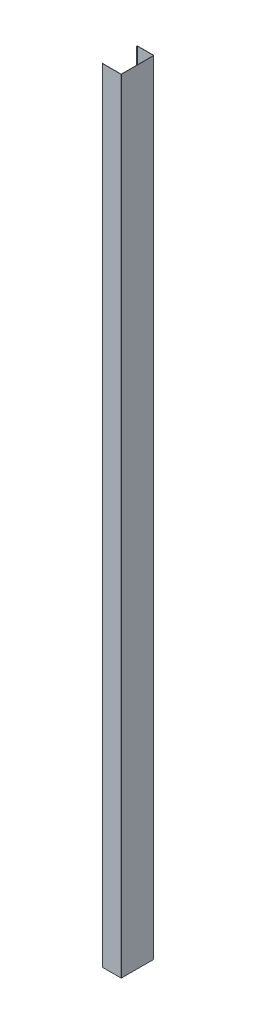
ISO-10303-21;
HEADER;
FILE_DESCRIPTION(('STEP AP214'),'2;1');
FILE_NAME('part.step','',(''),(''),'','','');
FILE_SCHEMA(('AUTOMOTIVE_DESIGN { 1 0 10303 214 1 1 1 1 }'));
ENDSEC;
DATA;
#1=APPLICATION_CONTEXT('core data for automotive mechanical design processes');
#2=APPLICATION_PROTOCOL_DEFINITION('international standard','automotive_design',2000,#1);
#3=PRODUCT_CONTEXT('',#1,'mechanical');
#4=PRODUCT('Part','Part','',(#3));
#5=PRODUCT_RELATED_PRODUCT_CATEGORY('part','',(#4));
#6=PRODUCT_DEFINITION_FORMATION('','',#4);
#7=PRODUCT_DEFINITION_CONTEXT('part definition',#1,'design');
#8=PRODUCT_DEFINITION('design','',#6,#7);
#9=PRODUCT_DEFINITION_SHAPE('','',#8);
#10=(LENGTH_UNIT() NAMED_UNIT(*) SI_UNIT(.MILLI.,.METRE.));
#11=(NAMED_UNIT(*) PLANE_ANGLE_UNIT() SI_UNIT($,.RADIAN.));
#12=(NAMED_UNIT(*) SI_UNIT($,.STERADIAN.) SOLID_ANGLE_UNIT());
#13=UNCERTAINTY_MEASURE_WITH_UNIT(LENGTH_MEASURE(1.E-05),#10,'distance_accuracy_value','');
#14=(GEOMETRIC_REPRESENTATION_CONTEXT(3) GLOBAL_UNCERTAINTY_ASSIGNED_CONTEXT((#13)) GLOBAL_UNIT_ASSIGNED_CONTEXT((#10,
#11,#12)) REPRESENTATION_CONTEXT('',''));
#15=CARTESIAN_POINT('',(0.,0.,0.));
#16=DIRECTION('',(0.,0.,1.));
#17=DIRECTION('',(1.,0.,0.));
#18=AXIS2_PLACEMENT_3D('',#15,#16,#17);
#19=CARTESIAN_POINT('',(-56.3111716302014,0.,98.5));
#20=DIRECTION('',(0.,-1.,0.));
#21=DIRECTION('',(0.,0.,-1.));
#22=AXIS2_PLACEMENT_3D('',#19,#20,#21);
#23=PLANE('',#22);
#24=DIRECTION('',(0.,0.,-1.));
#25=VECTOR('',#24,1.);
#26=CARTESIAN_POINT('',(-56.3111716302014,0.,98.5));
#27=LINE('',#26,#25);
#28=CARTESIAN_POINT('',(-56.3111716302014,0.,98.5));
#29=VERTEX_POINT('',#28);
#30=CARTESIAN_POINT('',(-56.3111716302014,0.,97.75));
#31=VERTEX_POINT('',#30);
#32=EDGE_CURVE('E11',#29,#31,#27,.T.);
#33=ORIENTED_EDGE('',*,*,#32,.F.);
#34=CARTESIAN_POINT('',(-56.3111716302014,0.,97.));
#35=DIRECTION('',(0.,-1.,0.));
#36=DIRECTION('',(0.,0.,-1.));
#37=AXIS2_PLACEMENT_3D('',#34,#35,#36);
#38=CIRCLE('',#37,1.5);
#39=CARTESIAN_POINT('',(-57.8111716302014,0.,97.));
#40=VERTEX_POINT('',#39);
#41=EDGE_CURVE('E249',#40,#29,#38,.F.);
#42=ORIENTED_EDGE('',*,*,#41,.F.);
#43=DIRECTION('',(-1.,0.,0.));
#44=VECTOR('',#43,1.);
#45=CARTESIAN_POINT('',(-57.0611716302014,0.,97.));
#46=LINE('',#45,#44);
#47=CARTESIAN_POINT('',(-57.0611716302014,0.,97.));
#48=VERTEX_POINT('',#47);
#49=EDGE_CURVE('E44',#48,#40,#46,.T.);
#50=ORIENTED_EDGE('',*,*,#49,.F.);
#51=CARTESIAN_POINT('',(-56.3111716302014,0.,97.));
#52=DIRECTION('',(0.,1.,0.));
#53=DIRECTION('',(1.,0.,0.));
#54=AXIS2_PLACEMENT_3D('',#51,#52,#53);
#55=CIRCLE('',#54,0.75);
#56=EDGE_CURVE('E352',#48,#31,#55,.T.);
#57=ORIENTED_EDGE('',*,*,#56,.T.);
#58=EDGE_LOOP('',(#33,#42,#50,#57));
#59=FACE_BOUND('',#58,.T.);
#60=ADVANCED_FACE('F37',(#59),#23,.T.);
#61=CARTESIAN_POINT('',(-57.0611716302014,0.,97.));
#62=DIRECTION('',(0.,-1.,0.));
#63=DIRECTION('',(0.,0.,-1.));
#64=AXIS2_PLACEMENT_3D('',#61,#62,#63);
#65=PLANE('',#64);
#66=DIRECTION('',(1.,0.,0.));
#67=VECTOR('',#66,1.);
#68=CARTESIAN_POINT('',(0.,0.,98.5));
#69=LINE('',#68,#67);
#70=CARTESIAN_POINT('',(-1.49999999999999,0.,98.5));
#71=VERTEX_POINT('',#70);
#72=EDGE_CURVE('E263',#29,#71,#69,.T.);
#73=ORIENTED_EDGE('',*,*,#72,.F.);
#74=ORIENTED_EDGE('',*,*,#32,.T.);
#75=DIRECTION('',(1.,0.,0.));
#76=VECTOR('',#75,1.);
#77=CARTESIAN_POINT('',(0.,0.,97.75));
#78=LINE('',#77,#76);
#79=CARTESIAN_POINT('',(-1.49999999999999,0.,97.75));
#80=VERTEX_POINT('',#79);
#81=EDGE_CURVE('E349',#31,#80,#78,.T.);
#82=ORIENTED_EDGE('',*,*,#81,.T.);
#83=DIRECTION('',(0.,0.,1.));
#84=VECTOR('',#83,1.);
#85=CARTESIAN_POINT('',(-1.49999999999999,0.,97.75));
#86=LINE('',#85,#84);
#87=EDGE_CURVE('E224',#80,#71,#86,.T.);
#88=ORIENTED_EDGE('',*,*,#87,.T.);
#89=EDGE_LOOP('',(#73,#74,#82,#88));
#90=FACE_BOUND('',#89,.T.);
#91=ADVANCED_FACE('F377',(#90),#65,.T.);
#92=CARTESIAN_POINT('',(0.,0.,97.));
#93=DIRECTION('',(0.,-1.,0.));
#94=DIRECTION('',(0.,0.,-1.));
#95=AXIS2_PLACEMENT_3D('',#92,#93,#94);
#96=PLANE('',#95);
#97=DIRECTION('',(-1.,0.,0.));
#98=VECTOR('',#97,1.);
#99=CARTESIAN_POINT('',(0.,0.,97.));
#100=LINE('',#99,#98);
#101=CARTESIAN_POINT('',(0.,0.,97.));
#102=VERTEX_POINT('',#101);
#103=CARTESIAN_POINT('',(-0.749999999999988,0.,97.));
#104=VERTEX_POINT('',#103);
#105=EDGE_CURVE('E226',#102,#104,#100,.T.);
#106=ORIENTED_EDGE('',*,*,#105,.F.);
#107=CARTESIAN_POINT('',(-1.49999999999999,0.,97.));
#108=DIRECTION('',(0.,-1.,0.));
#109=DIRECTION('',(0.,0.,-1.));
#110=AXIS2_PLACEMENT_3D('',#107,#108,#109);
#111=CIRCLE('',#110,1.5);
#112=EDGE_CURVE('E266',#71,#102,#111,.F.);
#113=ORIENTED_EDGE('',*,*,#112,.F.);
#114=ORIENTED_EDGE('',*,*,#87,.F.);
#115=CARTESIAN_POINT('',(-1.49999999999999,0.,97.));
#116=DIRECTION('',(0.,1.,0.));
#117=DIRECTION('',(1.,0.,0.));
#118=AXIS2_PLACEMENT_3D('',#115,#116,#117);
#119=CIRCLE('',#118,0.75);
#120=EDGE_CURVE('E343',#80,#104,#119,.T.);
#121=ORIENTED_EDGE('',*,*,#120,.T.);
#122=EDGE_LOOP('',(#106,#113,#114,#121));
#123=FACE_BOUND('',#122,.T.);
#124=ADVANCED_FACE('F384',(#123),#96,.T.);
#125=CARTESIAN_POINT('',(-1.49999999999999,0.,97.75));
#126=DIRECTION('',(0.,-1.,0.));
#127=DIRECTION('',(0.,0.,-1.));
#128=AXIS2_PLACEMENT_3D('',#125,#126,#127);
#129=PLANE('',#128);
#130=DIRECTION('',(0.,0.,-1.));
#131=VECTOR('',#130,1.);
#132=CARTESIAN_POINT('',(0.,0.,0.));
#133=LINE('',#132,#131);
#134=CARTESIAN_POINT('',(0.,0.,1.5));
#135=VERTEX_POINT('',#134);
#136=EDGE_CURVE('E272',#102,#135,#133,.T.);
#137=ORIENTED_EDGE('',*,*,#136,.F.);
#138=ORIENTED_EDGE('',*,*,#105,.T.);
#139=DIRECTION('',(0.,0.,-1.));
#140=VECTOR('',#139,1.);
#141=CARTESIAN_POINT('',(-0.75,0.,0.));
#142=LINE('',#141,#140);
#143=CARTESIAN_POINT('',(-0.75,0.,1.5));
#144=VERTEX_POINT('',#143);
#145=EDGE_CURVE('E341',#104,#144,#142,.T.);
#146=ORIENTED_EDGE('',*,*,#145,.T.);
#147=DIRECTION('',(1.,0.,0.));
#148=VECTOR('',#147,1.);
#149=CARTESIAN_POINT('',(-0.75,0.,1.5));
#150=LINE('',#149,#148);
#151=EDGE_CURVE('E220',#144,#135,#150,.T.);
#152=ORIENTED_EDGE('',*,*,#151,.T.);
#153=EDGE_LOOP('',(#137,#138,#146,#152));
#154=FACE_BOUND('',#153,.T.);
#155=ADVANCED_FACE('F391',(#154),#129,.T.);
#156=CARTESIAN_POINT('',(-1.5,0.,0.));
#157=DIRECTION('',(0.,-1.,0.));
#158=DIRECTION('',(0.,0.,-1.));
#159=AXIS2_PLACEMENT_3D('',#156,#157,#158);
#160=PLANE('',#159);
#161=DIRECTION('',(0.,0.,1.));
#162=VECTOR('',#161,1.);
#163=CARTESIAN_POINT('',(-1.5,0.,0.));
#164=LINE('',#163,#162);
#165=CARTESIAN_POINT('',(-1.5,0.,0.));
#166=VERTEX_POINT('',#165);
#167=CARTESIAN_POINT('',(-1.5,0.,0.75));
#168=VERTEX_POINT('',#167);
#169=EDGE_CURVE('E222',#166,#168,#164,.T.);
#170=ORIENTED_EDGE('',*,*,#169,.F.);
#171=CARTESIAN_POINT('',(-1.5,0.,1.5));
#172=DIRECTION('',(0.,-1.,0.));
#173=DIRECTION('',(0.,0.,-1.));
#174=AXIS2_PLACEMENT_3D('',#171,#172,#173);
#175=CIRCLE('',#174,1.5);
#176=EDGE_CURVE('E275',#135,#166,#175,.F.);
#177=ORIENTED_EDGE('',*,*,#176,.F.);
#178=ORIENTED_EDGE('',*,*,#151,.F.);
#179=CARTESIAN_POINT('',(-1.5,0.,1.5));
#180=DIRECTION('',(0.,1.,0.));
#181=DIRECTION('',(1.,0.,0.));
#182=AXIS2_PLACEMENT_3D('',#179,#180,#181);
#183=CIRCLE('',#182,0.75);
#184=EDGE_CURVE('E327',#144,#168,#183,.T.);
#185=ORIENTED_EDGE('',*,*,#184,.T.);
#186=EDGE_LOOP('',(#170,#177,#178,#185));
#187=FACE_BOUND('',#186,.T.);
#188=ADVANCED_FACE('F339',(#187),#160,.T.);
#189=CARTESIAN_POINT('',(-0.75,0.,1.5));
#190=DIRECTION('',(0.,-1.,0.));
#191=DIRECTION('',(0.,0.,-1.));
#192=AXIS2_PLACEMENT_3D('',#189,#190,#191);
#193=PLANE('',#192);
#194=DIRECTION('',(-1.,0.,0.));
#195=VECTOR('',#194,1.);
#196=CARTESIAN_POINT('',(-50.,0.,0.));
#197=LINE('',#196,#195);
#198=CARTESIAN_POINT('',(-48.5,0.,0.));
#199=VERTEX_POINT('',#198);
#200=EDGE_CURVE('E278',#166,#199,#197,.T.);
#201=ORIENTED_EDGE('',*,*,#200,.F.);
#202=ORIENTED_EDGE('',*,*,#169,.T.);
#203=DIRECTION('',(1.,0.,0.));
#204=VECTOR('',#203,1.);
#205=CARTESIAN_POINT('',(-50.,0.,0.75));
#206=LINE('',#205,#204);
#207=CARTESIAN_POINT('',(-48.5,0.,0.75));
#208=VERTEX_POINT('',#207);
#209=EDGE_CURVE('E333',#168,#208,#206,.F.);
#210=ORIENTED_EDGE('',*,*,#209,.T.);
#211=DIRECTION('',(0.,0.,-1.));
#212=VECTOR('',#211,1.);
#213=CARTESIAN_POINT('',(-48.5,0.,0.75));
#214=LINE('',#213,#212);
#215=EDGE_CURVE('E217',#208,#199,#214,.T.);
#216=ORIENTED_EDGE('',*,*,#215,.T.);
#217=EDGE_LOOP('',(#201,#202,#210,#216));
#218=FACE_BOUND('',#217,.T.);
#219=ADVANCED_FACE('F401',(#218),#193,.T.);
#220=CARTESIAN_POINT('',(-50.,0.,1.5));
#221=DIRECTION('',(0.,-1.,0.));
#222=DIRECTION('',(0.,0.,-1.));
#223=AXIS2_PLACEMENT_3D('',#220,#221,#222);
#224=PLANE('',#223);
#225=DIRECTION('',(1.,0.,0.));
#226=VECTOR('',#225,1.);
#227=CARTESIAN_POINT('',(-50.,0.,1.5));
#228=LINE('',#227,#226);
#229=CARTESIAN_POINT('',(-50.,0.,1.5));
#230=VERTEX_POINT('',#229);
#231=CARTESIAN_POINT('',(-49.25,0.,1.5));
#232=VERTEX_POINT('',#231);
#233=EDGE_CURVE('E59',#230,#232,#228,.T.);
#234=ORIENTED_EDGE('',*,*,#233,.F.);
#235=CARTESIAN_POINT('',(-48.5,0.,1.5));
#236=DIRECTION('',(0.,-1.,0.));
#237=DIRECTION('',(0.,0.,-1.));
#238=AXIS2_PLACEMENT_3D('',#235,#236,#237);
#239=CIRCLE('',#238,1.5);
#240=EDGE_CURVE('E281',#199,#230,#239,.F.);
#241=ORIENTED_EDGE('',*,*,#240,.F.);
#242=ORIENTED_EDGE('',*,*,#215,.F.);
#243=CARTESIAN_POINT('',(-48.5,0.,1.5));
#244=DIRECTION('',(0.,1.,0.));
#245=DIRECTION('',(1.,0.,0.));
#246=AXIS2_PLACEMENT_3D('',#243,#244,#245);
#247=CIRCLE('',#246,0.75);
#248=EDGE_CURVE('E336',#208,#232,#247,.T.);
#249=ORIENTED_EDGE('',*,*,#248,.T.);
#250=EDGE_LOOP('',(#234,#241,#242,#249));
#251=FACE_BOUND('',#250,.T.);
#252=ADVANCED_FACE('F405',(#251),#224,.T.);
#253=CARTESIAN_POINT('',(-48.5,0.,0.75));
#254=DIRECTION('',(0.,-1.,0.));
#255=DIRECTION('',(0.,0.,-1.));
#256=AXIS2_PLACEMENT_3D('',#253,#254,#255);
#257=PLANE('',#256);
#258=DIRECTION('',(0.,0.,1.));
#259=VECTOR('',#258,1.);
#260=CARTESIAN_POINT('',(-50.,0.,0.));
#261=LINE('',#260,#259);
#262=CARTESIAN_POINT('',(-50.,0.,3.));
#263=VERTEX_POINT('',#262);
#264=EDGE_CURVE('E192',#230,#263,#261,.T.);
#265=ORIENTED_EDGE('',*,*,#264,.F.);
#266=ORIENTED_EDGE('',*,*,#233,.T.);
#267=DIRECTION('',(0.,0.,-1.));
#268=VECTOR('',#267,1.);
#269=CARTESIAN_POINT('',(-49.25,0.,0.));
#270=LINE('',#269,#268);
#271=CARTESIAN_POINT('',(-49.25,0.,3.));
#272=VERTEX_POINT('',#271);
#273=EDGE_CURVE('E207',#232,#272,#270,.F.);
#274=ORIENTED_EDGE('',*,*,#273,.T.);
#275=DIRECTION('',(-1.,0.,0.));
#276=VECTOR('',#275,1.);
#277=CARTESIAN_POINT('',(-49.25,0.,3.));
#278=LINE('',#277,#276);
#279=EDGE_CURVE('E415',#272,#263,#278,.T.);
#280=ORIENTED_EDGE('',*,*,#279,.T.);
#281=EDGE_LOOP('',(#265,#266,#274,#280));
#282=FACE_BOUND('',#281,.T.);
#283=ADVANCED_FACE('F413',(#282),#257,.T.);
#284=CARTESIAN_POINT('',(-50.,2463.46200271975,0.));
#285=DIRECTION('',(1.,0.,0.));
#286=DIRECTION('',(0.,0.,-1.));
#287=AXIS2_PLACEMENT_3D('',#284,#285,#286);
#288=PLANE('',#287);
#289=DIRECTION('',(0.,0.,-1.));
#290=VECTOR('',#289,1.);
#291=CARTESIAN_POINT('',(-50.,2349.25,0.));
#292=LINE('',#291,#290);
#293=CARTESIAN_POINT('',(-50.,2349.25,3.));
#294=VERTEX_POINT('',#293);
#295=CARTESIAN_POINT('',(-50.,2349.25,1.5));
#296=VERTEX_POINT('',#295);
#297=EDGE_CURVE('E183',#294,#296,#292,.T.);
#298=ORIENTED_EDGE('',*,*,#297,.T.);
#299=DIRECTION('',(0.,-1.,0.));
#300=VECTOR('',#299,1.);
#301=CARTESIAN_POINT('',(-50.,2463.46200271975,1.5));
#302=LINE('',#301,#300);
#303=EDGE_CURVE('E284',#296,#230,#302,.T.);
#304=ORIENTED_EDGE('',*,*,#303,.T.);
#305=ORIENTED_EDGE('',*,*,#264,.T.);
#306=DIRECTION('',(0.,-1.,0.));
#307=VECTOR('',#306,1.);
#308=CARTESIAN_POINT('',(-50.,2463.46200271975,3.));
#309=LINE('',#308,#307);
#310=EDGE_CURVE('E210',#294,#263,#309,.T.);
#311=ORIENTED_EDGE('',*,*,#310,.F.);
#312=EDGE_LOOP('',(#298,#304,#305,#311));
#313=FACE_BOUND('',#312,.T.);
#314=ADVANCED_FACE('F515',(#313),#288,.F.);
#315=CARTESIAN_POINT('',(-49.25,2463.46200271975,3.));
#316=DIRECTION('',(0.,0.,1.));
#317=DIRECTION('',(1.,0.,0.));
#318=AXIS2_PLACEMENT_3D('',#315,#316,#317);
#319=PLANE('',#318);
#320=DIRECTION('',(0.,-1.,0.));
#321=VECTOR('',#320,1.);
#322=CARTESIAN_POINT('',(-49.25,2463.46200271975,3.));
#323=LINE('',#322,#321);
#324=CARTESIAN_POINT('',(-49.25,2349.25,3.));
#325=VERTEX_POINT('',#324);
#326=EDGE_CURVE('E208',#325,#272,#323,.T.);
#327=ORIENTED_EDGE('',*,*,#326,.F.);
#328=DIRECTION('',(-1.,0.,0.));
#329=VECTOR('',#328,1.);
#330=CARTESIAN_POINT('',(-50.,2349.25,3.));
#331=LINE('',#330,#329);
#332=EDGE_CURVE('E179',#294,#325,#331,.F.);
#333=ORIENTED_EDGE('',*,*,#332,.F.);
#334=ORIENTED_EDGE('',*,*,#310,.T.);
#335=ORIENTED_EDGE('',*,*,#279,.F.);
#336=EDGE_LOOP('',(#327,#333,#334,#335));
#337=FACE_BOUND('',#336,.T.);
#338=ADVANCED_FACE('F518',(#337),#319,.T.);
#339=CARTESIAN_POINT('',(-49.25,2463.46200271975,0.));
#340=DIRECTION('',(1.,0.,0.));
#341=DIRECTION('',(0.,0.,-1.));
#342=AXIS2_PLACEMENT_3D('',#339,#340,#341);
#343=PLANE('',#342);
#344=DIRECTION('',(0.,-1.,0.));
#345=VECTOR('',#344,1.);
#346=CARTESIAN_POINT('',(-49.25,2463.46200271975,1.5));
#347=LINE('',#346,#345);
#348=CARTESIAN_POINT('',(-49.25,2349.25,1.5));
#349=VERTEX_POINT('',#348);
#350=EDGE_CURVE('E199',#349,#232,#347,.T.);
#351=ORIENTED_EDGE('',*,*,#350,.F.);
#352=DIRECTION('',(0.,0.,-1.));
#353=VECTOR('',#352,1.);
#354=CARTESIAN_POINT('',(-49.25,2349.25,0.));
#355=LINE('',#354,#353);
#356=EDGE_CURVE('E173',#325,#349,#355,.T.);
#357=ORIENTED_EDGE('',*,*,#356,.F.);
#358=ORIENTED_EDGE('',*,*,#326,.T.);
#359=ORIENTED_EDGE('',*,*,#273,.F.);
#360=EDGE_LOOP('',(#351,#357,#358,#359));
#361=FACE_BOUND('',#360,.T.);
#362=ADVANCED_FACE('F205',(#361),#343,.T.);
#363=CARTESIAN_POINT('',(-48.5,2463.46200271975,1.5));
#364=DIRECTION('',(0.,-1.,0.));
#365=DIRECTION('',(0.,0.,-1.));
#366=AXIS2_PLACEMENT_3D('',#363,#364,#365);
#367=CYLINDRICAL_SURFACE('',#366,0.75);
#368=DIRECTION('',(0.,-1.,0.));
#369=VECTOR('',#368,1.);
#370=CARTESIAN_POINT('',(-48.5,2463.46200271975,0.75));
#371=LINE('',#370,#369);
#372=CARTESIAN_POINT('',(-48.5,2349.25,0.75));
#373=VERTEX_POINT('',#372);
#374=EDGE_CURVE('E202',#373,#208,#371,.T.);
#375=ORIENTED_EDGE('',*,*,#374,.F.);
#376=CARTESIAN_POINT('',(-48.5,2349.25,1.5));
#377=DIRECTION('',(0.,1.,0.));
#378=DIRECTION('',(-1.,0.,0.));
#379=AXIS2_PLACEMENT_3D('',#376,#377,#378);
#380=CIRCLE('',#379,0.75);
#381=EDGE_CURVE('E188',#349,#373,#380,.F.);
#382=ORIENTED_EDGE('',*,*,#381,.F.);
#383=ORIENTED_EDGE('',*,*,#350,.T.);
#384=ORIENTED_EDGE('',*,*,#248,.F.);
#385=EDGE_LOOP('',(#375,#382,#383,#384));
#386=FACE_BOUND('',#385,.T.);
#387=ADVANCED_FACE('F197',(#386),#367,.F.);
#388=CARTESIAN_POINT('',(-50.,2463.46200271975,0.75));
#389=DIRECTION('',(0.,0.,1.));
#390=DIRECTION('',(1.,0.,0.));
#391=AXIS2_PLACEMENT_3D('',#388,#389,#390);
#392=PLANE('',#391);
#393=DIRECTION('',(0.,-1.,0.));
#394=VECTOR('',#393,1.);
#395=CARTESIAN_POINT('',(-1.5,2463.46200271975,0.75));
#396=LINE('',#395,#394);
#397=CARTESIAN_POINT('',(-1.5,2349.25,0.75));
#398=VERTEX_POINT('',#397);
#399=EDGE_CURVE('E212',#398,#168,#396,.T.);
#400=ORIENTED_EDGE('',*,*,#399,.F.);
#401=DIRECTION('',(1.,0.,0.));
#402=VECTOR('',#401,1.);
#403=CARTESIAN_POINT('',(-50.,2349.25,0.75));
#404=LINE('',#403,#402);
#405=EDGE_CURVE('E438',#373,#398,#404,.T.);
#406=ORIENTED_EDGE('',*,*,#405,.F.);
#407=ORIENTED_EDGE('',*,*,#374,.T.);
#408=ORIENTED_EDGE('',*,*,#209,.F.);
#409=EDGE_LOOP('',(#400,#406,#407,#408));
#410=FACE_BOUND('',#409,.T.);
#411=ADVANCED_FACE('F334',(#410),#392,.T.);
#412=CARTESIAN_POINT('',(-1.5,2463.46200271975,1.5));
#413=DIRECTION('',(0.,-1.,0.));
#414=DIRECTION('',(0.,0.,-1.));
#415=AXIS2_PLACEMENT_3D('',#412,#413,#414);
#416=CYLINDRICAL_SURFACE('',#415,0.75);
#417=DIRECTION('',(0.,-1.,0.));
#418=VECTOR('',#417,1.);
#419=CARTESIAN_POINT('',(-0.75,2463.46200271975,1.5));
#420=LINE('',#419,#418);
#421=CARTESIAN_POINT('',(-0.75,2349.25,1.5));
#422=VERTEX_POINT('',#421);
#423=EDGE_CURVE('E316',#422,#144,#420,.T.);
#424=ORIENTED_EDGE('',*,*,#423,.F.);
#425=CARTESIAN_POINT('',(-1.5,2349.25,1.5));
#426=DIRECTION('',(0.,1.,0.));
#427=DIRECTION('',(-1.,0.,0.));
#428=AXIS2_PLACEMENT_3D('',#425,#426,#427);
#429=CIRCLE('',#428,0.75);
#430=EDGE_CURVE('E329',#398,#422,#429,.F.);
#431=ORIENTED_EDGE('',*,*,#430,.F.);
#432=ORIENTED_EDGE('',*,*,#399,.T.);
#433=ORIENTED_EDGE('',*,*,#184,.F.);
#434=EDGE_LOOP('',(#424,#431,#432,#433));
#435=FACE_BOUND('',#434,.T.);
#436=ADVANCED_FACE('F325',(#435),#416,.F.);
#437=CARTESIAN_POINT('',(-0.75,2463.46200271975,0.));
#438=DIRECTION('',(-1.,0.,0.));
#439=DIRECTION('',(0.,0.,1.));
#440=AXIS2_PLACEMENT_3D('',#437,#438,#439);
#441=PLANE('',#440);
#442=DIRECTION('',(0.,-1.,0.));
#443=VECTOR('',#442,1.);
#444=CARTESIAN_POINT('',(-0.749999999999988,2463.46200271975,97.));
#445=LINE('',#444,#443);
#446=CARTESIAN_POINT('',(-0.749999999999988,2349.25,97.));
#447=VERTEX_POINT('',#446);
#448=EDGE_CURVE('E313',#447,#104,#445,.T.);
#449=ORIENTED_EDGE('',*,*,#448,.F.);
#450=DIRECTION('',(0.,0.,1.));
#451=VECTOR('',#450,1.);
#452=CARTESIAN_POINT('',(-0.75,2349.25,0.));
#453=LINE('',#452,#451);
#454=EDGE_CURVE('E429',#422,#447,#453,.T.);
#455=ORIENTED_EDGE('',*,*,#454,.F.);
#456=ORIENTED_EDGE('',*,*,#423,.T.);
#457=ORIENTED_EDGE('',*,*,#145,.F.);
#458=EDGE_LOOP('',(#449,#455,#456,#457));
#459=FACE_BOUND('',#458,.T.);
#460=ADVANCED_FACE('F530',(#459),#441,.T.);
#461=CARTESIAN_POINT('',(-1.49999999999999,2463.46200271975,97.));
#462=DIRECTION('',(0.,-1.,0.));
#463=DIRECTION('',(0.,0.,-1.));
#464=AXIS2_PLACEMENT_3D('',#461,#462,#463);
#465=CYLINDRICAL_SURFACE('',#464,0.75);
#466=DIRECTION('',(0.,-1.,0.));
#467=VECTOR('',#466,1.);
#468=CARTESIAN_POINT('',(-1.49999999999999,2463.46200271975,97.75));
#469=LINE('',#468,#467);
#470=CARTESIAN_POINT('',(-1.49999999999999,2349.25,97.75));
#471=VERTEX_POINT('',#470);
#472=EDGE_CURVE('E310',#471,#80,#469,.T.);
#473=ORIENTED_EDGE('',*,*,#472,.F.);
#474=CARTESIAN_POINT('',(-1.49999999999999,2349.25,97.));
#475=DIRECTION('',(0.,1.,0.));
#476=DIRECTION('',(-1.,0.,0.));
#477=AXIS2_PLACEMENT_3D('',#474,#475,#476);
#478=CIRCLE('',#477,0.75);
#479=EDGE_CURVE('E461',#447,#471,#478,.F.);
#480=ORIENTED_EDGE('',*,*,#479,.F.);
#481=ORIENTED_EDGE('',*,*,#448,.T.);
#482=ORIENTED_EDGE('',*,*,#120,.F.);
#483=EDGE_LOOP('',(#473,#480,#481,#482));
#484=FACE_BOUND('',#483,.T.);
#485=ADVANCED_FACE('F533',(#484),#465,.F.);
#486=CARTESIAN_POINT('',(0.,2463.46200271975,97.75));
#487=DIRECTION('',(0.,0.,-1.));
#488=DIRECTION('',(-1.,0.,0.));
#489=AXIS2_PLACEMENT_3D('',#486,#487,#488);
#490=PLANE('',#489);
#491=DIRECTION('',(0.,-1.,0.));
#492=VECTOR('',#491,1.);
#493=CARTESIAN_POINT('',(-56.3111716302014,2463.46200271975,97.75));
#494=LINE('',#493,#492);
#495=CARTESIAN_POINT('',(-56.3111716302014,2349.25,97.75));
#496=VERTEX_POINT('',#495);
#497=EDGE_CURVE('E307',#496,#31,#494,.T.);
#498=ORIENTED_EDGE('',*,*,#497,.F.);
#499=DIRECTION('',(-1.,0.,0.));
#500=VECTOR('',#499,1.);
#501=CARTESIAN_POINT('',(0.,2349.25,97.75));
#502=LINE('',#501,#500);
#503=EDGE_CURVE('E453',#471,#496,#502,.T.);
#504=ORIENTED_EDGE('',*,*,#503,.F.);
#505=ORIENTED_EDGE('',*,*,#472,.T.);
#506=ORIENTED_EDGE('',*,*,#81,.F.);
#507=EDGE_LOOP('',(#498,#504,#505,#506));
#508=FACE_BOUND('',#507,.T.);
#509=ADVANCED_FACE('F373',(#508),#490,.T.);
#510=CARTESIAN_POINT('',(-56.3111716302014,2463.46200271975,97.));
#511=DIRECTION('',(0.,-1.,0.));
#512=DIRECTION('',(0.,0.,-1.));
#513=AXIS2_PLACEMENT_3D('',#510,#511,#512);
#514=CYLINDRICAL_SURFACE('',#513,0.75);
#515=DIRECTION('',(0.,-1.,0.));
#516=VECTOR('',#515,1.);
#517=CARTESIAN_POINT('',(-57.0611716302014,2463.46200271975,97.));
#518=LINE('',#517,#516);
#519=CARTESIAN_POINT('',(-57.0611716302014,2349.25,97.));
#520=VERTEX_POINT('',#519);
#521=EDGE_CURVE('E305',#520,#48,#518,.T.);
#522=ORIENTED_EDGE('',*,*,#521,.F.);
#523=CARTESIAN_POINT('',(-56.3111716302014,2349.25,97.));
#524=DIRECTION('',(0.,1.,0.));
#525=DIRECTION('',(-1.,0.,0.));
#526=AXIS2_PLACEMENT_3D('',#523,#524,#525);
#527=CIRCLE('',#526,0.75);
#528=EDGE_CURVE('E370',#496,#520,#527,.F.);
#529=ORIENTED_EDGE('',*,*,#528,.F.);
#530=ORIENTED_EDGE('',*,*,#497,.T.);
#531=ORIENTED_EDGE('',*,*,#56,.F.);
#532=EDGE_LOOP('',(#522,#529,#530,#531));
#533=FACE_BOUND('',#532,.T.);
#534=ADVANCED_FACE('F367',(#533),#514,.F.);
#535=CARTESIAN_POINT('',(-57.0611716302014,2463.46200271975,98.5));
#536=DIRECTION('',(1.,0.,0.));
#537=DIRECTION('',(0.,0.,-1.));
#538=AXIS2_PLACEMENT_3D('',#535,#536,#537);
#539=PLANE('',#538);
#540=DIRECTION('',(0.,-1.,0.));
#541=VECTOR('',#540,1.);
#542=CARTESIAN_POINT('',(-57.0611716302014,2463.46200271975,95.5));
#543=LINE('',#542,#541);
#544=CARTESIAN_POINT('',(-57.0611716302014,2349.25,95.5));
#545=VERTEX_POINT('',#544);
#546=CARTESIAN_POINT('',(-57.0611716302014,0.,95.5));
#547=VERTEX_POINT('',#546);
#548=EDGE_CURVE('E303',#545,#547,#543,.T.);
#549=ORIENTED_EDGE('',*,*,#548,.F.);
#550=DIRECTION('',(0.,0.,-1.));
#551=VECTOR('',#550,1.);
#552=CARTESIAN_POINT('',(-57.0611716302014,2349.25,98.5));
#553=LINE('',#552,#551);
#554=EDGE_CURVE('E364',#520,#545,#553,.T.);
#555=ORIENTED_EDGE('',*,*,#554,.F.);
#556=ORIENTED_EDGE('',*,*,#521,.T.);
#557=DIRECTION('',(0.,0.,-1.));
#558=VECTOR('',#557,1.);
#559=CARTESIAN_POINT('',(-57.0611716302014,0.,98.5));
#560=LINE('',#559,#558);
#561=EDGE_CURVE('E237',#547,#48,#560,.F.);
#562=ORIENTED_EDGE('',*,*,#561,.F.);
#563=EDGE_LOOP('',(#549,#555,#556,#562));
#564=FACE_BOUND('',#563,.T.);
#565=ADVANCED_FACE('F361',(#564),#539,.T.);
#566=CARTESIAN_POINT('',(-57.8111716302014,2463.46200271975,95.5));
#567=DIRECTION('',(0.,0.,-1.));
#568=DIRECTION('',(-1.,0.,0.));
#569=AXIS2_PLACEMENT_3D('',#566,#567,#568);
#570=PLANE('',#569);
#571=DIRECTION('',(0.,-1.,0.));
#572=VECTOR('',#571,1.);
#573=CARTESIAN_POINT('',(-57.8111716302014,2463.46200271975,95.5));
#574=LINE('',#573,#572);
#575=CARTESIAN_POINT('',(-57.8111716302014,2349.25,95.5));
#576=VERTEX_POINT('',#575);
#577=CARTESIAN_POINT('',(-57.8111716302014,0.,95.5));
#578=VERTEX_POINT('',#577);
#579=EDGE_CURVE('E255',#576,#578,#574,.T.);
#580=ORIENTED_EDGE('',*,*,#579,.F.);
#581=DIRECTION('',(-1.,0.,0.));
#582=VECTOR('',#581,1.);
#583=CARTESIAN_POINT('',(-57.8111716302014,2349.25,95.5));
#584=LINE('',#583,#582);
#585=EDGE_CURVE('E358',#576,#545,#584,.F.);
#586=ORIENTED_EDGE('',*,*,#585,.T.);
#587=ORIENTED_EDGE('',*,*,#548,.T.);
#588=DIRECTION('',(1.,0.,0.));
#589=VECTOR('',#588,1.);
#590=CARTESIAN_POINT('',(-57.8111716302014,0.,95.5));
#591=LINE('',#590,#589);
#592=EDGE_CURVE('E260',#578,#547,#591,.T.);
#593=ORIENTED_EDGE('',*,*,#592,.F.);
#594=EDGE_LOOP('',(#580,#586,#587,#593));
#595=FACE_BOUND('',#594,.T.);
#596=ADVANCED_FACE('F355',(#595),#570,.T.);
#597=CARTESIAN_POINT('',(-57.8111716302014,2463.46200271975,98.5));
#598=DIRECTION('',(1.,0.,0.));
#599=DIRECTION('',(0.,0.,-1.));
#600=AXIS2_PLACEMENT_3D('',#597,#598,#599);
#601=PLANE('',#600);
#602=DIRECTION('',(0.,0.,-1.));
#603=VECTOR('',#602,1.);
#604=CARTESIAN_POINT('',(-57.8111716302014,2349.25,98.5));
#605=LINE('',#604,#603);
#606=CARTESIAN_POINT('',(-57.8111716302014,2349.25,97.));
#607=VERTEX_POINT('',#606);
#608=EDGE_CURVE('E203',#607,#576,#605,.T.);
#609=ORIENTED_EDGE('',*,*,#608,.T.);
#610=ORIENTED_EDGE('',*,*,#579,.T.);
#611=DIRECTION('',(0.,0.,1.));
#612=VECTOR('',#611,1.);
#613=CARTESIAN_POINT('',(-57.8111716302014,0.,98.5));
#614=LINE('',#613,#612);
#615=EDGE_CURVE('E234',#578,#40,#614,.T.);
#616=ORIENTED_EDGE('',*,*,#615,.T.);
#617=DIRECTION('',(0.,-1.,0.));
#618=VECTOR('',#617,1.);
#619=CARTESIAN_POINT('',(-57.8111716302014,2463.46200271975,97.));
#620=LINE('',#619,#618);
#621=EDGE_CURVE('E246',#607,#40,#620,.T.);
#622=ORIENTED_EDGE('',*,*,#621,.F.);
#623=EDGE_LOOP('',(#609,#610,#616,#622));
#624=FACE_BOUND('',#623,.T.);
#625=ADVANCED_FACE('F258',(#624),#601,.F.);
#626=CARTESIAN_POINT('',(-56.3111716302014,2463.46200271975,97.));
#627=DIRECTION('',(0.,-1.,0.));
#628=DIRECTION('',(0.,0.,-1.));
#629=AXIS2_PLACEMENT_3D('',#626,#627,#628);
#630=CYLINDRICAL_SURFACE('',#629,1.5);
#631=CARTESIAN_POINT('',(-56.3111716302014,2349.25,97.));
#632=DIRECTION('',(0.,-1.,0.));
#633=DIRECTION('',(1.,0.,0.));
#634=AXIS2_PLACEMENT_3D('',#631,#632,#633);
#635=CIRCLE('',#634,1.5);
#636=CARTESIAN_POINT('',(-56.3111716302014,2349.25,98.5));
#637=VERTEX_POINT('',#636);
#638=EDGE_CURVE('E252',#637,#607,#635,.T.);
#639=ORIENTED_EDGE('',*,*,#638,.T.);
#640=ORIENTED_EDGE('',*,*,#621,.T.);
#641=ORIENTED_EDGE('',*,*,#41,.T.);
#642=DIRECTION('',(0.,-1.,0.));
#643=VECTOR('',#642,1.);
#644=CARTESIAN_POINT('',(-56.3111716302014,2463.46200271975,98.5));
#645=LINE('',#644,#643);
#646=EDGE_CURVE('E256',#637,#29,#645,.T.);
#647=ORIENTED_EDGE('',*,*,#646,.F.);
#648=EDGE_LOOP('',(#639,#640,#641,#647));
#649=FACE_BOUND('',#648,.T.);
#650=ADVANCED_FACE('F247',(#649),#630,.T.);
#651=CARTESIAN_POINT('',(0.,2463.46200271975,98.5));
#652=DIRECTION('',(0.,0.,-1.));
#653=DIRECTION('',(-1.,0.,0.));
#654=AXIS2_PLACEMENT_3D('',#651,#652,#653);
#655=PLANE('',#654);
#656=DIRECTION('',(-1.,0.,0.));
#657=VECTOR('',#656,1.);
#658=CARTESIAN_POINT('',(0.,2349.25,98.5));
#659=LINE('',#658,#657);
#660=CARTESIAN_POINT('',(-1.49999999999999,2349.25,98.5));
#661=VERTEX_POINT('',#660);
#662=EDGE_CURVE('E447',#661,#637,#659,.T.);
#663=ORIENTED_EDGE('',*,*,#662,.T.);
#664=ORIENTED_EDGE('',*,*,#646,.T.);
#665=ORIENTED_EDGE('',*,*,#72,.T.);
#666=DIRECTION('',(0.,-1.,0.));
#667=VECTOR('',#666,1.);
#668=CARTESIAN_POINT('',(-1.49999999999999,2463.46200271975,98.5));
#669=LINE('',#668,#667);
#670=EDGE_CURVE('E298',#661,#71,#669,.T.);
#671=ORIENTED_EDGE('',*,*,#670,.F.);
#672=EDGE_LOOP('',(#663,#664,#665,#671));
#673=FACE_BOUND('',#672,.T.);
#674=ADVANCED_FACE('F382',(#673),#655,.F.);
#675=CARTESIAN_POINT('',(-1.49999999999999,2463.46200271975,97.));
#676=DIRECTION('',(0.,-1.,0.));
#677=DIRECTION('',(0.,0.,-1.));
#678=AXIS2_PLACEMENT_3D('',#675,#676,#677);
#679=CYLINDRICAL_SURFACE('',#678,1.5);
#680=CARTESIAN_POINT('',(-1.49999999999999,2349.25,97.));
#681=DIRECTION('',(0.,-1.,0.));
#682=DIRECTION('',(1.,0.,0.));
#683=AXIS2_PLACEMENT_3D('',#680,#681,#682);
#684=CIRCLE('',#683,1.5);
#685=CARTESIAN_POINT('',(0.,2349.25,97.));
#686=VERTEX_POINT('',#685);
#687=EDGE_CURVE('E459',#686,#661,#684,.T.);
#688=ORIENTED_EDGE('',*,*,#687,.T.);
#689=ORIENTED_EDGE('',*,*,#670,.T.);
#690=ORIENTED_EDGE('',*,*,#112,.T.);
#691=DIRECTION('',(0.,-1.,0.));
#692=VECTOR('',#691,1.);
#693=CARTESIAN_POINT('',(0.,2463.46200271975,97.));
#694=LINE('',#693,#692);
#695=EDGE_CURVE('E295',#686,#102,#694,.T.);
#696=ORIENTED_EDGE('',*,*,#695,.F.);
#697=EDGE_LOOP('',(#688,#689,#690,#696));
#698=FACE_BOUND('',#697,.T.);
#699=ADVANCED_FACE('F389',(#698),#679,.T.);
#700=CARTESIAN_POINT('',(0.,2463.46200271975,0.));
#701=DIRECTION('',(-1.,0.,0.));
#702=DIRECTION('',(0.,0.,1.));
#703=AXIS2_PLACEMENT_3D('',#700,#701,#702);
#704=PLANE('',#703);
#705=DIRECTION('',(0.,0.,1.));
#706=VECTOR('',#705,1.);
#707=CARTESIAN_POINT('',(0.,2349.25,0.));
#708=LINE('',#707,#706);
#709=CARTESIAN_POINT('',(0.,2349.25,1.5));
#710=VERTEX_POINT('',#709);
#711=EDGE_CURVE('E432',#710,#686,#708,.T.);
#712=ORIENTED_EDGE('',*,*,#711,.T.);
#713=ORIENTED_EDGE('',*,*,#695,.T.);
#714=ORIENTED_EDGE('',*,*,#136,.T.);
#715=DIRECTION('',(0.,-1.,0.));
#716=VECTOR('',#715,1.);
#717=CARTESIAN_POINT('',(0.,2463.46200271975,1.5));
#718=LINE('',#717,#716);
#719=EDGE_CURVE('E292',#710,#135,#718,.T.);
#720=ORIENTED_EDGE('',*,*,#719,.F.);
#721=EDGE_LOOP('',(#712,#713,#714,#720));
#722=FACE_BOUND('',#721,.T.);
#723=ADVANCED_FACE('F395',(#722),#704,.F.);
#724=CARTESIAN_POINT('',(-1.5,2463.46200271975,1.5));
#725=DIRECTION('',(0.,-1.,0.));
#726=DIRECTION('',(0.,0.,-1.));
#727=AXIS2_PLACEMENT_3D('',#724,#725,#726);
#728=CYLINDRICAL_SURFACE('',#727,1.5);
#729=CARTESIAN_POINT('',(-1.5,2349.25,1.5));
#730=DIRECTION('',(0.,-1.,0.));
#731=DIRECTION('',(1.,0.,0.));
#732=AXIS2_PLACEMENT_3D('',#729,#730,#731);
#733=CIRCLE('',#732,1.5);
#734=CARTESIAN_POINT('',(-1.5,2349.25,0.));
#735=VERTEX_POINT('',#734);
#736=EDGE_CURVE('E463',#735,#710,#733,.T.);
#737=ORIENTED_EDGE('',*,*,#736,.T.);
#738=ORIENTED_EDGE('',*,*,#719,.T.);
#739=ORIENTED_EDGE('',*,*,#176,.T.);
#740=DIRECTION('',(0.,-1.,0.));
#741=VECTOR('',#740,1.);
#742=CARTESIAN_POINT('',(-1.5,2463.46200271975,0.));
#743=LINE('',#742,#741);
#744=EDGE_CURVE('E289',#735,#166,#743,.T.);
#745=ORIENTED_EDGE('',*,*,#744,.F.);
#746=EDGE_LOOP('',(#737,#738,#739,#745));
#747=FACE_BOUND('',#746,.T.);
#748=ADVANCED_FACE('F400',(#747),#728,.T.);
#749=CARTESIAN_POINT('',(-50.,2463.46200271975,0.));
#750=DIRECTION('',(0.,0.,1.));
#751=DIRECTION('',(1.,0.,0.));
#752=AXIS2_PLACEMENT_3D('',#749,#750,#751);
#753=PLANE('',#752);
#754=DIRECTION('',(1.,0.,0.));
#755=VECTOR('',#754,1.);
#756=CARTESIAN_POINT('',(-50.,2349.25,0.));
#757=LINE('',#756,#755);
#758=CARTESIAN_POINT('',(-48.5,2349.25,0.));
#759=VERTEX_POINT('',#758);
#760=EDGE_CURVE('E51',#759,#735,#757,.T.);
#761=ORIENTED_EDGE('',*,*,#760,.T.);
#762=ORIENTED_EDGE('',*,*,#744,.T.);
#763=ORIENTED_EDGE('',*,*,#200,.T.);
#764=DIRECTION('',(0.,-1.,0.));
#765=VECTOR('',#764,1.);
#766=CARTESIAN_POINT('',(-48.5,2463.46200271975,0.));
#767=LINE('',#766,#765);
#768=EDGE_CURVE('E286',#759,#199,#767,.T.);
#769=ORIENTED_EDGE('',*,*,#768,.F.);
#770=EDGE_LOOP('',(#761,#762,#763,#769));
#771=FACE_BOUND('',#770,.T.);
#772=ADVANCED_FACE('F404',(#771),#753,.F.);
#773=CARTESIAN_POINT('',(-48.5,2463.46200271975,1.5));
#774=DIRECTION('',(0.,-1.,0.));
#775=DIRECTION('',(0.,0.,-1.));
#776=AXIS2_PLACEMENT_3D('',#773,#774,#775);
#777=CYLINDRICAL_SURFACE('',#776,1.5);
#778=CARTESIAN_POINT('',(-48.5,2349.25,1.5));
#779=DIRECTION('',(0.,-1.,0.));
#780=DIRECTION('',(1.,0.,0.));
#781=AXIS2_PLACEMENT_3D('',#778,#779,#780);
#782=CIRCLE('',#781,1.5);
#783=EDGE_CURVE('E190',#296,#759,#782,.T.);
#784=ORIENTED_EDGE('',*,*,#783,.T.);
#785=ORIENTED_EDGE('',*,*,#768,.T.);
#786=ORIENTED_EDGE('',*,*,#240,.T.);
#787=ORIENTED_EDGE('',*,*,#303,.F.);
#788=EDGE_LOOP('',(#784,#785,#786,#787));
#789=FACE_BOUND('',#788,.T.);
#790=ADVANCED_FACE('F409',(#789),#777,.T.);
#791=CARTESIAN_POINT('',(-48.5,0.,1.5));
#792=DIRECTION('',(0.,1.,0.));
#793=DIRECTION('',(1.,0.,0.));
#794=AXIS2_PLACEMENT_3D('',#791,#792,#793);
#795=PLANE('',#794);
#796=ORIENTED_EDGE('',*,*,#561,.T.);
#797=ORIENTED_EDGE('',*,*,#49,.T.);
#798=ORIENTED_EDGE('',*,*,#615,.F.);
#799=ORIENTED_EDGE('',*,*,#592,.T.);
#800=EDGE_LOOP('',(#796,#797,#798,#799));
#801=FACE_BOUND('',#800,.T.);
#802=ADVANCED_FACE('F231',(#801),#795,.F.);
#803=CARTESIAN_POINT('',(-50.,2349.25,0.));
#804=DIRECTION('',(0.,-1.,0.));
#805=DIRECTION('',(0.,0.,-1.));
#806=AXIS2_PLACEMENT_3D('',#803,#804,#805);
#807=PLANE('',#806);
#808=DIRECTION('',(-1.,0.,0.));
#809=VECTOR('',#808,1.);
#810=CARTESIAN_POINT('',(-50.,2349.25,1.5));
#811=LINE('',#810,#809);
#812=EDGE_CURVE('E176',#296,#349,#811,.F.);
#813=ORIENTED_EDGE('',*,*,#812,.F.);
#814=ORIENTED_EDGE('',*,*,#297,.F.);
#815=ORIENTED_EDGE('',*,*,#332,.T.);
#816=ORIENTED_EDGE('',*,*,#356,.T.);
#817=EDGE_LOOP('',(#813,#814,#815,#816));
#818=FACE_BOUND('',#817,.T.);
#819=ADVANCED_FACE('F175',(#818),#807,.F.);
#820=CARTESIAN_POINT('',(-57.8111716302014,2349.25,98.5));
#821=DIRECTION('',(0.,-1.,0.));
#822=DIRECTION('',(0.,0.,-1.));
#823=AXIS2_PLACEMENT_3D('',#820,#821,#822);
#824=PLANE('',#823);
#825=ORIENTED_EDGE('',*,*,#585,.F.);
#826=ORIENTED_EDGE('',*,*,#608,.F.);
#827=DIRECTION('',(-1.,0.,0.));
#828=VECTOR('',#827,1.);
#829=CARTESIAN_POINT('',(-57.8111716302014,2349.25,97.));
#830=LINE('',#829,#828);
#831=EDGE_CURVE('E443',#607,#520,#830,.F.);
#832=ORIENTED_EDGE('',*,*,#831,.T.);
#833=ORIENTED_EDGE('',*,*,#554,.T.);
#834=EDGE_LOOP('',(#825,#826,#832,#833));
#835=FACE_BOUND('',#834,.T.);
#836=ADVANCED_FACE('F485',(#835),#824,.F.);
#837=CARTESIAN_POINT('',(-56.3111716302014,2349.25,97.));
#838=DIRECTION('',(0.,1.,0.));
#839=DIRECTION('',(-1.,0.,0.));
#840=AXIS2_PLACEMENT_3D('',#837,#838,#839);
#841=PLANE('',#840);
#842=ORIENTED_EDGE('',*,*,#528,.T.);
#843=ORIENTED_EDGE('',*,*,#831,.F.);
#844=ORIENTED_EDGE('',*,*,#638,.F.);
#845=DIRECTION('',(0.,0.,1.));
#846=VECTOR('',#845,1.);
#847=CARTESIAN_POINT('',(-56.3111716302014,2349.25,98.5));
#848=LINE('',#847,#846);
#849=EDGE_CURVE('E434',#637,#496,#848,.F.);
#850=ORIENTED_EDGE('',*,*,#849,.T.);
#851=EDGE_LOOP('',(#842,#843,#844,#850));
#852=FACE_BOUND('',#851,.T.);
#853=ADVANCED_FACE('F482',(#852),#841,.T.);
#854=CARTESIAN_POINT('',(0.,2349.25,98.5));
#855=DIRECTION('',(0.,-1.,0.));
#856=DIRECTION('',(-1.,0.,0.));
#857=AXIS2_PLACEMENT_3D('',#854,#855,#856);
#858=PLANE('',#857);
#859=ORIENTED_EDGE('',*,*,#849,.F.);
#860=ORIENTED_EDGE('',*,*,#662,.F.);
#861=DIRECTION('',(0.,0.,1.));
#862=VECTOR('',#861,1.);
#863=CARTESIAN_POINT('',(-1.49999999999999,2349.25,98.5));
#864=LINE('',#863,#862);
#865=EDGE_CURVE('E450',#661,#471,#864,.F.);
#866=ORIENTED_EDGE('',*,*,#865,.T.);
#867=ORIENTED_EDGE('',*,*,#503,.T.);
#868=EDGE_LOOP('',(#859,#860,#866,#867));
#869=FACE_BOUND('',#868,.T.);
#870=ADVANCED_FACE('F480',(#869),#858,.F.);
#871=CARTESIAN_POINT('',(-1.49999999999999,2349.25,97.));
#872=DIRECTION('',(0.,1.,0.));
#873=DIRECTION('',(-1.,0.,0.));
#874=AXIS2_PLACEMENT_3D('',#871,#872,#873);
#875=PLANE('',#874);
#876=ORIENTED_EDGE('',*,*,#479,.T.);
#877=ORIENTED_EDGE('',*,*,#865,.F.);
#878=ORIENTED_EDGE('',*,*,#687,.F.);
#879=DIRECTION('',(1.,0.,0.));
#880=VECTOR('',#879,1.);
#881=CARTESIAN_POINT('',(0.,2349.25,97.));
#882=LINE('',#881,#880);
#883=EDGE_CURVE('E428',#686,#447,#882,.F.);
#884=ORIENTED_EDGE('',*,*,#883,.T.);
#885=EDGE_LOOP('',(#876,#877,#878,#884));
#886=FACE_BOUND('',#885,.T.);
#887=ADVANCED_FACE('F477',(#886),#875,.T.);
#888=CARTESIAN_POINT('',(0.,2349.25,0.));
#889=DIRECTION('',(0.,-1.,0.));
#890=DIRECTION('',(0.,0.,1.));
#891=AXIS2_PLACEMENT_3D('',#888,#889,#890);
#892=PLANE('',#891);
#893=ORIENTED_EDGE('',*,*,#883,.F.);
#894=ORIENTED_EDGE('',*,*,#711,.F.);
#895=DIRECTION('',(1.,0.,0.));
#896=VECTOR('',#895,1.);
#897=CARTESIAN_POINT('',(0.,2349.25,1.5));
#898=LINE('',#897,#896);
#899=EDGE_CURVE('E425',#710,#422,#898,.F.);
#900=ORIENTED_EDGE('',*,*,#899,.T.);
#901=ORIENTED_EDGE('',*,*,#454,.T.);
#902=EDGE_LOOP('',(#893,#894,#900,#901));
#903=FACE_BOUND('',#902,.T.);
#904=ADVANCED_FACE('F473',(#903),#892,.F.);
#905=CARTESIAN_POINT('',(-1.5,2349.25,1.5));
#906=DIRECTION('',(0.,1.,0.));
#907=DIRECTION('',(-1.,0.,0.));
#908=AXIS2_PLACEMENT_3D('',#905,#906,#907);
#909=PLANE('',#908);
#910=ORIENTED_EDGE('',*,*,#430,.T.);
#911=ORIENTED_EDGE('',*,*,#899,.F.);
#912=ORIENTED_EDGE('',*,*,#736,.F.);
#913=DIRECTION('',(0.,0.,-1.));
#914=VECTOR('',#913,1.);
#915=CARTESIAN_POINT('',(-1.5,2349.25,0.));
#916=LINE('',#915,#914);
#917=EDGE_CURVE('E423',#735,#398,#916,.F.);
#918=ORIENTED_EDGE('',*,*,#917,.T.);
#919=EDGE_LOOP('',(#910,#911,#912,#918));
#920=FACE_BOUND('',#919,.T.);
#921=ADVANCED_FACE('F469',(#920),#909,.T.);
#922=CARTESIAN_POINT('',(-50.,2349.25,0.));
#923=DIRECTION('',(0.,-1.,0.));
#924=DIRECTION('',(1.,0.,0.));
#925=AXIS2_PLACEMENT_3D('',#922,#923,#924);
#926=PLANE('',#925);
#927=ORIENTED_EDGE('',*,*,#917,.F.);
#928=ORIENTED_EDGE('',*,*,#760,.F.);
#929=DIRECTION('',(0.,0.,-1.));
#930=VECTOR('',#929,1.);
#931=CARTESIAN_POINT('',(-48.5,2349.25,0.));
#932=LINE('',#931,#930);
#933=EDGE_CURVE('E436',#759,#373,#932,.F.);
#934=ORIENTED_EDGE('',*,*,#933,.T.);
#935=ORIENTED_EDGE('',*,*,#405,.T.);
#936=EDGE_LOOP('',(#927,#928,#934,#935));
#937=FACE_BOUND('',#936,.T.);
#938=ADVANCED_FACE('F565',(#937),#926,.F.);
#939=CARTESIAN_POINT('',(-48.5,2349.25,1.5));
#940=DIRECTION('',(0.,1.,0.));
#941=DIRECTION('',(-1.,0.,0.));
#942=AXIS2_PLACEMENT_3D('',#939,#940,#941);
#943=PLANE('',#942);
#944=ORIENTED_EDGE('',*,*,#381,.T.);
#945=ORIENTED_EDGE('',*,*,#933,.F.);
#946=ORIENTED_EDGE('',*,*,#783,.F.);
#947=ORIENTED_EDGE('',*,*,#812,.T.);
#948=EDGE_LOOP('',(#944,#945,#946,#947));
#949=FACE_BOUND('',#948,.T.);
#950=ADVANCED_FACE('F187',(#949),#943,.T.);
#951=CLOSED_SHELL('',(#60,#91,#124,#155,#188,#219,#252,#283,#314,#338,#362,#387,#411,#436,#460,
#485,#509,#534,#565,#596,#625,#650,#674,#699,#723,#748,#772,#790,#802,#819,#836,#853,#870,#887,
#904,#921,#938,#950));
#952=MANIFOLD_SOLID_BREP('B2',#951);
#953=ADVANCED_BREP_SHAPE_REPRESENTATION('',(#18,#952),#14);
#954=SHAPE_DEFINITION_REPRESENTATION(#9,#953);
ENDSEC;
END-ISO-10303-21;
